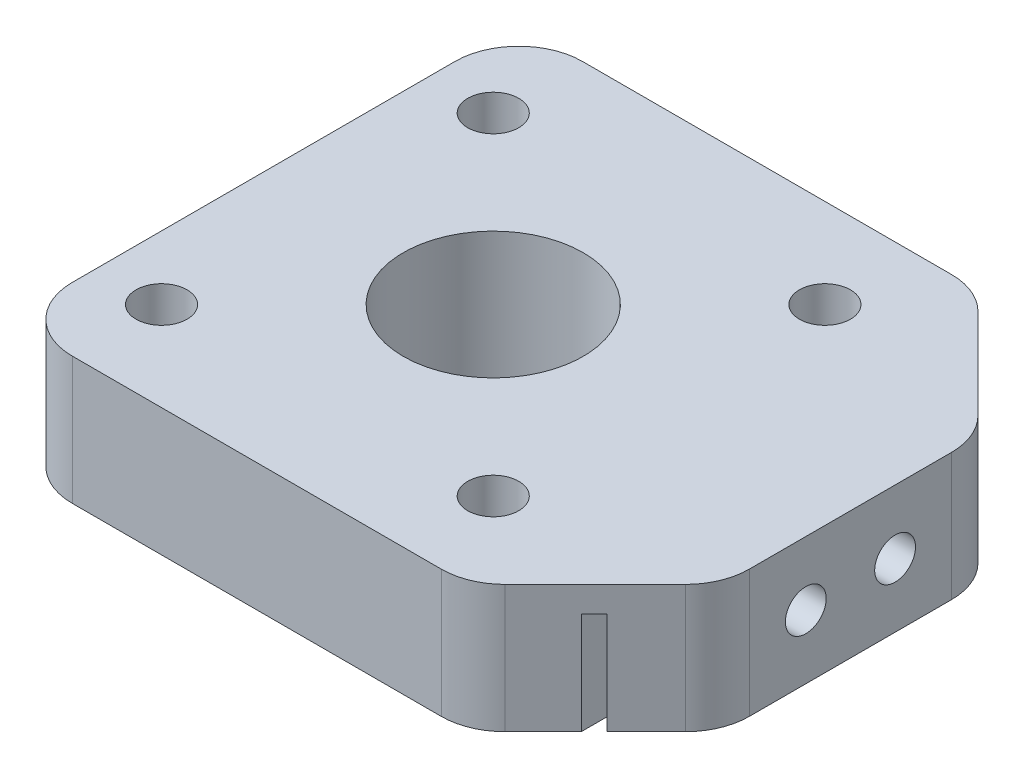
ISO-10303-21;
HEADER;
FILE_DESCRIPTION(('STEP AP214'),'2;1');
FILE_NAME('part.step','',(''),(''),'','','');
FILE_SCHEMA(('AUTOMOTIVE_DESIGN { 1 0 10303 214 1 1 1 1 }'));
ENDSEC;
DATA;
#1=APPLICATION_CONTEXT('core data for automotive mechanical design processes');
#2=APPLICATION_PROTOCOL_DEFINITION('international standard','automotive_design',2000,#1);
#3=PRODUCT_CONTEXT('',#1,'mechanical');
#4=PRODUCT('Part','Part','',(#3));
#5=PRODUCT_RELATED_PRODUCT_CATEGORY('part','',(#4));
#6=PRODUCT_DEFINITION_FORMATION('','',#4);
#7=PRODUCT_DEFINITION_CONTEXT('part definition',#1,'design');
#8=PRODUCT_DEFINITION('design','',#6,#7);
#9=PRODUCT_DEFINITION_SHAPE('','',#8);
#10=(LENGTH_UNIT() NAMED_UNIT(*) SI_UNIT(.MILLI.,.METRE.));
#11=(NAMED_UNIT(*) PLANE_ANGLE_UNIT() SI_UNIT($,.RADIAN.));
#12=(NAMED_UNIT(*) SI_UNIT($,.STERADIAN.) SOLID_ANGLE_UNIT());
#13=UNCERTAINTY_MEASURE_WITH_UNIT(LENGTH_MEASURE(1.E-05),#10,'distance_accuracy_value','');
#14=(GEOMETRIC_REPRESENTATION_CONTEXT(3) GLOBAL_UNCERTAINTY_ASSIGNED_CONTEXT((#13)) GLOBAL_UNIT_ASSIGNED_CONTEXT((#10,
#11,#12)) REPRESENTATION_CONTEXT('',''));
#15=CARTESIAN_POINT('',(0.,0.,0.));
#16=DIRECTION('',(0.,0.,1.));
#17=DIRECTION('',(1.,0.,0.));
#18=AXIS2_PLACEMENT_3D('',#15,#16,#17);
#19=CARTESIAN_POINT('',(0.,0.,0.));
#20=DIRECTION('',(0.,-1.,0.));
#21=DIRECTION('',(0.,0.,-1.));
#22=AXIS2_PLACEMENT_3D('',#19,#20,#21);
#23=PLANE('',#22);
#24=DIRECTION('',(0.,0.,1.));
#25=VECTOR('',#24,1.);
#26=CARTESIAN_POINT('',(22.45,0.,-20.));
#27=LINE('',#26,#25);
#28=CARTESIAN_POINT('',(22.45,0.,-15.55));
#29=VERTEX_POINT('',#28);
#30=CARTESIAN_POINT('',(22.45,0.,15.55));
#31=VERTEX_POINT('',#30);
#32=EDGE_CURVE('E159',#29,#31,#27,.T.);
#33=ORIENTED_EDGE('',*,*,#32,.T.);
#34=DIRECTION('',(0.707106781186543,0.,-0.707106781186551));
#35=VECTOR('',#34,1.);
#36=CARTESIAN_POINT('',(18.,0.,20.));
#37=LINE('',#36,#35);
#38=CARTESIAN_POINT('',(19.4644660940673,0.,18.5355339059327));
#39=VERTEX_POINT('',#38);
#40=EDGE_CURVE('E190',#39,#31,#37,.T.);
#41=ORIENTED_EDGE('',*,*,#40,.F.);
#42=CARTESIAN_POINT('',(15.9289321881345,0.,15.));
#43=DIRECTION('',(0.,-1.,0.));
#44=DIRECTION('',(0.,0.,-1.));
#45=AXIS2_PLACEMENT_3D('',#42,#43,#44);
#46=CIRCLE('',#45,5.);
#47=CARTESIAN_POINT('',(15.9289321881345,0.,20.));
#48=VERTEX_POINT('',#47);
#49=EDGE_CURVE('E251',#39,#48,#46,.T.);
#50=ORIENTED_EDGE('',*,*,#49,.T.);
#51=DIRECTION('',(1.,0.,0.));
#52=VECTOR('',#51,1.);
#53=CARTESIAN_POINT('',(-18.,0.,20.));
#54=LINE('',#53,#52);
#55=CARTESIAN_POINT('',(-13.,0.,20.));
#56=VERTEX_POINT('',#55);
#57=EDGE_CURVE('E231',#56,#48,#54,.T.);
#58=ORIENTED_EDGE('',*,*,#57,.F.);
#59=CARTESIAN_POINT('',(-13.,0.,15.));
#60=DIRECTION('',(0.,-1.,0.));
#61=DIRECTION('',(0.,0.,-1.));
#62=AXIS2_PLACEMENT_3D('',#59,#60,#61);
#63=CIRCLE('',#62,5.);
#64=CARTESIAN_POINT('',(-18.,0.,15.));
#65=VERTEX_POINT('',#64);
#66=EDGE_CURVE('E247',#56,#65,#63,.T.);
#67=ORIENTED_EDGE('',*,*,#66,.T.);
#68=DIRECTION('',(0.,0.,1.));
#69=VECTOR('',#68,1.);
#70=CARTESIAN_POINT('',(-18.,0.,20.));
#71=LINE('',#70,#69);
#72=CARTESIAN_POINT('',(-18.,0.,-15.));
#73=VERTEX_POINT('',#72);
#74=EDGE_CURVE('E239',#73,#65,#71,.T.);
#75=ORIENTED_EDGE('',*,*,#74,.F.);
#76=CARTESIAN_POINT('',(-13.,0.,-15.));
#77=DIRECTION('',(0.,-1.,0.));
#78=DIRECTION('',(0.,0.,-1.));
#79=AXIS2_PLACEMENT_3D('',#76,#77,#78);
#80=CIRCLE('',#79,5.);
#81=CARTESIAN_POINT('',(-13.,0.,-20.));
#82=VERTEX_POINT('',#81);
#83=EDGE_CURVE('E249',#73,#82,#80,.T.);
#84=ORIENTED_EDGE('',*,*,#83,.T.);
#85=DIRECTION('',(-1.,0.,0.));
#86=VECTOR('',#85,1.);
#87=CARTESIAN_POINT('',(-18.,0.,-20.));
#88=LINE('',#87,#86);
#89=CARTESIAN_POINT('',(15.9289321881345,0.,-20.));
#90=VERTEX_POINT('',#89);
#91=EDGE_CURVE('E224',#90,#82,#88,.T.);
#92=ORIENTED_EDGE('',*,*,#91,.F.);
#93=CARTESIAN_POINT('',(15.9289321881345,0.,-15.));
#94=DIRECTION('',(0.,-1.,0.));
#95=DIRECTION('',(0.,0.,-1.));
#96=AXIS2_PLACEMENT_3D('',#93,#94,#95);
#97=CIRCLE('',#96,5.);
#98=CARTESIAN_POINT('',(19.4644660940673,0.,-18.5355339059327));
#99=VERTEX_POINT('',#98);
#100=EDGE_CURVE('E253',#90,#99,#97,.T.);
#101=ORIENTED_EDGE('',*,*,#100,.T.);
#102=DIRECTION('',(-0.707106781186543,0.,-0.707106781186552));
#103=VECTOR('',#102,1.);
#104=CARTESIAN_POINT('',(18.,0.,-20.));
#105=LINE('',#104,#103);
#106=EDGE_CURVE('E174',#29,#99,#105,.T.);
#107=ORIENTED_EDGE('',*,*,#106,.F.);
#108=EDGE_LOOP('',(#33,#41,#50,#58,#67,#75,#84,#92,#101,#107));
#109=FACE_BOUND('',#108,.T.);
#110=CARTESIAN_POINT('',(13.,0.,13.));
#111=DIRECTION('',(0.,1.,0.));
#112=DIRECTION('',(0.,0.,1.));
#113=AXIS2_PLACEMENT_3D('',#110,#111,#112);
#114=CIRCLE('',#113,2.);
#115=CARTESIAN_POINT('',(13.,0.,15.));
#116=VERTEX_POINT('',#115);
#117=EDGE_CURVE('E200',#116,#116,#114,.T.);
#118=ORIENTED_EDGE('',*,*,#117,.T.);
#119=EDGE_LOOP('',(#118));
#120=FACE_BOUND('',#119,.T.);
#121=CARTESIAN_POINT('',(13.,0.,-13.));
#122=DIRECTION('',(0.,1.,0.));
#123=DIRECTION('',(0.,0.,-1.));
#124=AXIS2_PLACEMENT_3D('',#121,#122,#123);
#125=CIRCLE('',#124,2.);
#126=CARTESIAN_POINT('',(13.,0.,-15.));
#127=VERTEX_POINT('',#126);
#128=EDGE_CURVE('E212',#127,#127,#125,.T.);
#129=ORIENTED_EDGE('',*,*,#128,.T.);
#130=EDGE_LOOP('',(#129));
#131=FACE_BOUND('',#130,.T.);
#132=CARTESIAN_POINT('',(-13.,0.,-13.));
#133=DIRECTION('',(0.,1.,0.));
#134=DIRECTION('',(0.,0.,1.));
#135=AXIS2_PLACEMENT_3D('',#132,#133,#134);
#136=CIRCLE('',#135,2.);
#137=CARTESIAN_POINT('',(-13.,0.,-11.));
#138=VERTEX_POINT('',#137);
#139=EDGE_CURVE('E218',#138,#138,#136,.T.);
#140=ORIENTED_EDGE('',*,*,#139,.T.);
#141=EDGE_LOOP('',(#140));
#142=FACE_BOUND('',#141,.T.);
#143=CARTESIAN_POINT('',(-13.,0.,13.));
#144=DIRECTION('',(0.,1.,0.));
#145=DIRECTION('',(0.,0.,-1.));
#146=AXIS2_PLACEMENT_3D('',#143,#144,#145);
#147=CIRCLE('',#146,2.);
#148=CARTESIAN_POINT('',(-13.,0.,11.));
#149=VERTEX_POINT('',#148);
#150=EDGE_CURVE('E206',#149,#149,#147,.T.);
#151=ORIENTED_EDGE('',*,*,#150,.T.);
#152=EDGE_LOOP('',(#151));
#153=FACE_BOUND('',#152,.T.);
#154=CARTESIAN_POINT('',(0.,0.,0.));
#155=DIRECTION('',(0.,1.,0.));
#156=DIRECTION('',(0.,0.,1.));
#157=AXIS2_PLACEMENT_3D('',#154,#155,#156);
#158=CIRCLE('',#157,7.05);
#159=CARTESIAN_POINT('',(0.,0.,7.05));
#160=VERTEX_POINT('',#159);
#161=EDGE_CURVE('E185',#160,#160,#158,.T.);
#162=ORIENTED_EDGE('',*,*,#161,.T.);
#163=EDGE_LOOP('',(#162));
#164=FACE_BOUND('',#163,.T.);
#165=ADVANCED_FACE('F38',(#109,#120,#131,#142,#153,#164),#23,.T.);
#166=CARTESIAN_POINT('',(0.,10.,0.));
#167=DIRECTION('',(0.,-1.,0.));
#168=DIRECTION('',(0.,0.,-1.));
#169=AXIS2_PLACEMENT_3D('',#166,#167,#168);
#170=PLANE('',#169);
#171=DIRECTION('',(-0.707106781186544,0.,0.707106781186552));
#172=VECTOR('',#171,1.);
#173=CARTESIAN_POINT('',(18.,10.,20.));
#174=LINE('',#173,#172);
#175=CARTESIAN_POINT('',(26.5355339059328,10.,11.4644660940672));
#176=VERTEX_POINT('',#175);
#177=CARTESIAN_POINT('',(19.4644660940673,10.,18.5355339059327));
#178=VERTEX_POINT('',#177);
#179=EDGE_CURVE('E178',#176,#178,#174,.T.);
#180=ORIENTED_EDGE('',*,*,#179,.F.);
#181=CARTESIAN_POINT('',(23.,10.,7.92893218813443));
#182=DIRECTION('',(0.,-1.,0.));
#183=DIRECTION('',(0.,0.,-1.));
#184=AXIS2_PLACEMENT_3D('',#181,#182,#183);
#185=CIRCLE('',#184,5.);
#186=CARTESIAN_POINT('',(28.,10.,7.92893218813444));
#187=VERTEX_POINT('',#186);
#188=EDGE_CURVE('E276',#176,#187,#185,.F.);
#189=ORIENTED_EDGE('',*,*,#188,.T.);
#190=DIRECTION('',(0.,0.,1.));
#191=VECTOR('',#190,1.);
#192=CARTESIAN_POINT('',(28.,10.,9.99999999999989));
#193=LINE('',#192,#191);
#194=CARTESIAN_POINT('',(28.,10.,-7.92893218813443));
#195=VERTEX_POINT('',#194);
#196=EDGE_CURVE('E182',#195,#187,#193,.T.);
#197=ORIENTED_EDGE('',*,*,#196,.F.);
#198=CARTESIAN_POINT('',(23.,10.,-7.92893218813443));
#199=DIRECTION('',(0.,-1.,0.));
#200=DIRECTION('',(0.,0.,-1.));
#201=AXIS2_PLACEMENT_3D('',#198,#199,#200);
#202=CIRCLE('',#201,5.);
#203=CARTESIAN_POINT('',(26.5355339059328,10.,-11.4644660940671));
#204=VERTEX_POINT('',#203);
#205=EDGE_CURVE('E274',#195,#204,#202,.F.);
#206=ORIENTED_EDGE('',*,*,#205,.T.);
#207=DIRECTION('',(0.707106781186544,0.,0.707106781186552));
#208=VECTOR('',#207,1.);
#209=CARTESIAN_POINT('',(18.,10.,-20.));
#210=LINE('',#209,#208);
#211=CARTESIAN_POINT('',(19.4644660940673,10.,-18.5355339059327));
#212=VERTEX_POINT('',#211);
#213=EDGE_CURVE('E181',#212,#204,#210,.T.);
#214=ORIENTED_EDGE('',*,*,#213,.F.);
#215=CARTESIAN_POINT('',(15.9289321881345,10.,-15.));
#216=DIRECTION('',(0.,-1.,0.));
#217=DIRECTION('',(0.,0.,-1.));
#218=AXIS2_PLACEMENT_3D('',#215,#216,#217);
#219=CIRCLE('',#218,5.);
#220=CARTESIAN_POINT('',(15.9289321881345,10.,-20.));
#221=VERTEX_POINT('',#220);
#222=EDGE_CURVE('E272',#212,#221,#219,.F.);
#223=ORIENTED_EDGE('',*,*,#222,.T.);
#224=DIRECTION('',(-1.,0.,0.));
#225=VECTOR('',#224,1.);
#226=CARTESIAN_POINT('',(-18.,10.,-20.));
#227=LINE('',#226,#225);
#228=CARTESIAN_POINT('',(-13.,10.,-20.));
#229=VERTEX_POINT('',#228);
#230=EDGE_CURVE('E227',#221,#229,#227,.T.);
#231=ORIENTED_EDGE('',*,*,#230,.T.);
#232=CARTESIAN_POINT('',(-13.,10.,-15.));
#233=DIRECTION('',(0.,-1.,0.));
#234=DIRECTION('',(0.,0.,-1.));
#235=AXIS2_PLACEMENT_3D('',#232,#233,#234);
#236=CIRCLE('',#235,5.);
#237=CARTESIAN_POINT('',(-18.,10.,-15.));
#238=VERTEX_POINT('',#237);
#239=EDGE_CURVE('E268',#229,#238,#236,.F.);
#240=ORIENTED_EDGE('',*,*,#239,.T.);
#241=DIRECTION('',(0.,0.,1.));
#242=VECTOR('',#241,1.);
#243=CARTESIAN_POINT('',(-18.,10.,20.));
#244=LINE('',#243,#242);
#245=CARTESIAN_POINT('',(-18.,10.,15.));
#246=VERTEX_POINT('',#245);
#247=EDGE_CURVE('E230',#238,#246,#244,.T.);
#248=ORIENTED_EDGE('',*,*,#247,.T.);
#249=CARTESIAN_POINT('',(-13.,10.,15.));
#250=DIRECTION('',(0.,-1.,0.));
#251=DIRECTION('',(0.,0.,-1.));
#252=AXIS2_PLACEMENT_3D('',#249,#250,#251);
#253=CIRCLE('',#252,5.);
#254=CARTESIAN_POINT('',(-13.,10.,20.));
#255=VERTEX_POINT('',#254);
#256=EDGE_CURVE('E266',#246,#255,#253,.F.);
#257=ORIENTED_EDGE('',*,*,#256,.T.);
#258=DIRECTION('',(1.,0.,0.));
#259=VECTOR('',#258,1.);
#260=CARTESIAN_POINT('',(-18.,10.,20.));
#261=LINE('',#260,#259);
#262=CARTESIAN_POINT('',(15.9289321881345,10.,20.));
#263=VERTEX_POINT('',#262);
#264=EDGE_CURVE('E233',#255,#263,#261,.T.);
#265=ORIENTED_EDGE('',*,*,#264,.T.);
#266=CARTESIAN_POINT('',(15.9289321881345,10.,15.));
#267=DIRECTION('',(0.,-1.,0.));
#268=DIRECTION('',(0.,0.,-1.));
#269=AXIS2_PLACEMENT_3D('',#266,#267,#268);
#270=CIRCLE('',#269,5.);
#271=EDGE_CURVE('E270',#263,#178,#270,.F.);
#272=ORIENTED_EDGE('',*,*,#271,.T.);
#273=EDGE_LOOP('',(#180,#189,#197,#206,#214,#223,#231,#240,#248,#257,#265,#272));
#274=FACE_BOUND('',#273,.T.);
#275=CARTESIAN_POINT('',(-13.,10.,-13.));
#276=DIRECTION('',(0.,1.,0.));
#277=DIRECTION('',(0.,0.,1.));
#278=AXIS2_PLACEMENT_3D('',#275,#276,#277);
#279=CIRCLE('',#278,2.);
#280=CARTESIAN_POINT('',(-13.,10.,-11.));
#281=VERTEX_POINT('',#280);
#282=EDGE_CURVE('E221',#281,#281,#279,.T.);
#283=ORIENTED_EDGE('',*,*,#282,.F.);
#284=EDGE_LOOP('',(#283));
#285=FACE_BOUND('',#284,.T.);
#286=CARTESIAN_POINT('',(13.,10.,-13.));
#287=DIRECTION('',(0.,1.,0.));
#288=DIRECTION('',(0.,0.,-1.));
#289=AXIS2_PLACEMENT_3D('',#286,#287,#288);
#290=CIRCLE('',#289,2.);
#291=CARTESIAN_POINT('',(13.,10.,-15.));
#292=VERTEX_POINT('',#291);
#293=EDGE_CURVE('E215',#292,#292,#290,.T.);
#294=ORIENTED_EDGE('',*,*,#293,.F.);
#295=EDGE_LOOP('',(#294));
#296=FACE_BOUND('',#295,.T.);
#297=CARTESIAN_POINT('',(-13.,10.,13.));
#298=DIRECTION('',(0.,1.,0.));
#299=DIRECTION('',(0.,0.,-1.));
#300=AXIS2_PLACEMENT_3D('',#297,#298,#299);
#301=CIRCLE('',#300,2.);
#302=CARTESIAN_POINT('',(-13.,10.,11.));
#303=VERTEX_POINT('',#302);
#304=EDGE_CURVE('E209',#303,#303,#301,.T.);
#305=ORIENTED_EDGE('',*,*,#304,.F.);
#306=EDGE_LOOP('',(#305));
#307=FACE_BOUND('',#306,.T.);
#308=CARTESIAN_POINT('',(13.,10.,13.));
#309=DIRECTION('',(0.,1.,0.));
#310=DIRECTION('',(0.,0.,1.));
#311=AXIS2_PLACEMENT_3D('',#308,#309,#310);
#312=CIRCLE('',#311,2.);
#313=CARTESIAN_POINT('',(13.,10.,15.));
#314=VERTEX_POINT('',#313);
#315=EDGE_CURVE('E203',#314,#314,#312,.T.);
#316=ORIENTED_EDGE('',*,*,#315,.F.);
#317=EDGE_LOOP('',(#316));
#318=FACE_BOUND('',#317,.T.);
#319=CARTESIAN_POINT('',(0.,10.,0.));
#320=DIRECTION('',(0.,1.,0.));
#321=DIRECTION('',(0.,0.,1.));
#322=AXIS2_PLACEMENT_3D('',#319,#320,#321);
#323=CIRCLE('',#322,7.05);
#324=CARTESIAN_POINT('',(0.,10.,7.05));
#325=VERTEX_POINT('',#324);
#326=EDGE_CURVE('E197',#325,#325,#323,.T.);
#327=ORIENTED_EDGE('',*,*,#326,.F.);
#328=EDGE_LOOP('',(#327));
#329=FACE_BOUND('',#328,.T.);
#330=ADVANCED_FACE('F339',(#274,#285,#296,#307,#318,#329),#170,.F.);
#331=DIRECTION('',(0.,0.,1.));
#332=VECTOR('',#331,1.);
#333=CARTESIAN_POINT('',(23.45,0.,-20.));
#334=LINE('',#333,#332);
#335=CARTESIAN_POINT('',(23.45,0.,-14.5499999999999));
#336=VERTEX_POINT('',#335);
#337=CARTESIAN_POINT('',(23.45,0.,14.5499999999999));
#338=VERTEX_POINT('',#337);
#339=EDGE_CURVE('E154',#336,#338,#334,.T.);
#340=ORIENTED_EDGE('',*,*,#339,.F.);
#341=CARTESIAN_POINT('',(26.5355339059328,0.,-11.4644660940671));
#342=VERTEX_POINT('',#341);
#343=EDGE_CURVE('E186',#342,#336,#105,.T.);
#344=ORIENTED_EDGE('',*,*,#343,.F.);
#345=CARTESIAN_POINT('',(23.,0.,-7.92893218813443));
#346=DIRECTION('',(0.,-1.,0.));
#347=DIRECTION('',(0.,0.,-1.));
#348=AXIS2_PLACEMENT_3D('',#345,#346,#347);
#349=CIRCLE('',#348,5.);
#350=CARTESIAN_POINT('',(28.,0.,-7.92893218813443));
#351=VERTEX_POINT('',#350);
#352=EDGE_CURVE('E256',#342,#351,#349,.T.);
#353=ORIENTED_EDGE('',*,*,#352,.T.);
#354=DIRECTION('',(0.,0.,-1.));
#355=VECTOR('',#354,1.);
#356=CARTESIAN_POINT('',(28.,0.,9.99999999999989));
#357=LINE('',#356,#355);
#358=CARTESIAN_POINT('',(28.,0.,7.92893218813444));
#359=VERTEX_POINT('',#358);
#360=EDGE_CURVE('E192',#359,#351,#357,.T.);
#361=ORIENTED_EDGE('',*,*,#360,.F.);
#362=CARTESIAN_POINT('',(23.,0.,7.92893218813443));
#363=DIRECTION('',(0.,-1.,0.));
#364=DIRECTION('',(0.,0.,-1.));
#365=AXIS2_PLACEMENT_3D('',#362,#363,#364);
#366=CIRCLE('',#365,5.);
#367=CARTESIAN_POINT('',(26.5355339059327,0.,11.4644660940672));
#368=VERTEX_POINT('',#367);
#369=EDGE_CURVE('E258',#359,#368,#366,.T.);
#370=ORIENTED_EDGE('',*,*,#369,.T.);
#371=EDGE_CURVE('E189',#338,#368,#37,.T.);
#372=ORIENTED_EDGE('',*,*,#371,.F.);
#373=EDGE_LOOP('',(#340,#344,#353,#361,#370,#372));
#374=FACE_BOUND('',#373,.T.);
#375=ADVANCED_FACE('F303',(#374),#23,.T.);
#376=CARTESIAN_POINT('',(-18.,10.,-20.));
#377=DIRECTION('',(0.,0.,1.));
#378=DIRECTION('',(1.,0.,0.));
#379=AXIS2_PLACEMENT_3D('',#376,#377,#378);
#380=PLANE('',#379);
#381=ORIENTED_EDGE('',*,*,#230,.F.);
#382=DIRECTION('',(0.,-1.,0.));
#383=VECTOR('',#382,1.);
#384=CARTESIAN_POINT('',(15.9289321881345,10.,-20.));
#385=LINE('',#384,#383);
#386=EDGE_CURVE('E285',#221,#90,#385,.T.);
#387=ORIENTED_EDGE('',*,*,#386,.T.);
#388=ORIENTED_EDGE('',*,*,#91,.T.);
#389=DIRECTION('',(0.,-1.,0.));
#390=VECTOR('',#389,1.);
#391=CARTESIAN_POINT('',(-13.,10.,-20.));
#392=LINE('',#391,#390);
#393=EDGE_CURVE('E283',#82,#229,#392,.F.);
#394=ORIENTED_EDGE('',*,*,#393,.T.);
#395=EDGE_LOOP('',(#381,#387,#388,#394));
#396=FACE_BOUND('',#395,.T.);
#397=ADVANCED_FACE('F350',(#396),#380,.F.);
#398=CARTESIAN_POINT('',(-18.,10.,20.));
#399=DIRECTION('',(1.,0.,0.));
#400=DIRECTION('',(0.,0.,-1.));
#401=AXIS2_PLACEMENT_3D('',#398,#399,#400);
#402=PLANE('',#401);
#403=ORIENTED_EDGE('',*,*,#247,.F.);
#404=DIRECTION('',(0.,-1.,0.));
#405=VECTOR('',#404,1.);
#406=CARTESIAN_POINT('',(-18.,10.,-15.));
#407=LINE('',#406,#405);
#408=EDGE_CURVE('E294',#238,#73,#407,.T.);
#409=ORIENTED_EDGE('',*,*,#408,.T.);
#410=ORIENTED_EDGE('',*,*,#74,.T.);
#411=DIRECTION('',(0.,-1.,0.));
#412=VECTOR('',#411,1.);
#413=CARTESIAN_POINT('',(-18.,10.,15.));
#414=LINE('',#413,#412);
#415=EDGE_CURVE('E61',#65,#246,#414,.F.);
#416=ORIENTED_EDGE('',*,*,#415,.T.);
#417=EDGE_LOOP('',(#403,#409,#410,#416));
#418=FACE_BOUND('',#417,.T.);
#419=ADVANCED_FACE('F354',(#418),#402,.F.);
#420=CARTESIAN_POINT('',(-18.,10.,20.));
#421=DIRECTION('',(0.,0.,-1.));
#422=DIRECTION('',(-1.,0.,0.));
#423=AXIS2_PLACEMENT_3D('',#420,#421,#422);
#424=PLANE('',#423);
#425=ORIENTED_EDGE('',*,*,#57,.T.);
#426=DIRECTION('',(0.,-1.,0.));
#427=VECTOR('',#426,1.);
#428=CARTESIAN_POINT('',(15.9289321881345,10.,20.));
#429=LINE('',#428,#427);
#430=EDGE_CURVE('E291',#48,#263,#429,.F.);
#431=ORIENTED_EDGE('',*,*,#430,.T.);
#432=ORIENTED_EDGE('',*,*,#264,.F.);
#433=DIRECTION('',(0.,-1.,0.));
#434=VECTOR('',#433,1.);
#435=CARTESIAN_POINT('',(-13.,10.,20.));
#436=LINE('',#435,#434);
#437=EDGE_CURVE('E288',#255,#56,#436,.T.);
#438=ORIENTED_EDGE('',*,*,#437,.T.);
#439=EDGE_LOOP('',(#425,#431,#432,#438));
#440=FACE_BOUND('',#439,.T.);
#441=ADVANCED_FACE('F360',(#440),#424,.F.);
#442=CARTESIAN_POINT('',(-13.,10.,-13.));
#443=DIRECTION('',(0.,-1.,0.));
#444=DIRECTION('',(0.,0.,-1.));
#445=AXIS2_PLACEMENT_3D('',#442,#443,#444);
#446=CYLINDRICAL_SURFACE('',#445,2.);
#447=ORIENTED_EDGE('',*,*,#282,.T.);
#448=EDGE_LOOP('',(#447));
#449=FACE_BOUND('',#448,.T.);
#450=ORIENTED_EDGE('',*,*,#139,.F.);
#451=EDGE_LOOP('',(#450));
#452=FACE_BOUND('',#451,.T.);
#453=ADVANCED_FACE('F433',(#449,#452),#446,.F.);
#454=CARTESIAN_POINT('',(13.,10.,-13.));
#455=DIRECTION('',(0.,-1.,0.));
#456=DIRECTION('',(0.,0.,-1.));
#457=AXIS2_PLACEMENT_3D('',#454,#455,#456);
#458=CYLINDRICAL_SURFACE('',#457,2.);
#459=ORIENTED_EDGE('',*,*,#293,.T.);
#460=EDGE_LOOP('',(#459));
#461=FACE_BOUND('',#460,.T.);
#462=ORIENTED_EDGE('',*,*,#128,.F.);
#463=EDGE_LOOP('',(#462));
#464=FACE_BOUND('',#463,.T.);
#465=ADVANCED_FACE('F429',(#461,#464),#458,.F.);
#466=CARTESIAN_POINT('',(-13.,10.,13.));
#467=DIRECTION('',(0.,-1.,0.));
#468=DIRECTION('',(0.,0.,-1.));
#469=AXIS2_PLACEMENT_3D('',#466,#467,#468);
#470=CYLINDRICAL_SURFACE('',#469,2.);
#471=ORIENTED_EDGE('',*,*,#304,.T.);
#472=EDGE_LOOP('',(#471));
#473=FACE_BOUND('',#472,.T.);
#474=ORIENTED_EDGE('',*,*,#150,.F.);
#475=EDGE_LOOP('',(#474));
#476=FACE_BOUND('',#475,.T.);
#477=ADVANCED_FACE('F425',(#473,#476),#470,.F.);
#478=CARTESIAN_POINT('',(13.,10.,13.));
#479=DIRECTION('',(0.,-1.,0.));
#480=DIRECTION('',(0.,0.,-1.));
#481=AXIS2_PLACEMENT_3D('',#478,#479,#480);
#482=CYLINDRICAL_SURFACE('',#481,2.);
#483=ORIENTED_EDGE('',*,*,#315,.T.);
#484=EDGE_LOOP('',(#483));
#485=FACE_BOUND('',#484,.T.);
#486=ORIENTED_EDGE('',*,*,#117,.F.);
#487=EDGE_LOOP('',(#486));
#488=FACE_BOUND('',#487,.T.);
#489=ADVANCED_FACE('F421',(#485,#488),#482,.F.);
#490=CARTESIAN_POINT('',(0.,10.,0.));
#491=DIRECTION('',(0.,-1.,0.));
#492=DIRECTION('',(0.,0.,-1.));
#493=AXIS2_PLACEMENT_3D('',#490,#491,#492);
#494=CYLINDRICAL_SURFACE('',#493,7.05);
#495=ORIENTED_EDGE('',*,*,#326,.T.);
#496=EDGE_LOOP('',(#495));
#497=FACE_BOUND('',#496,.T.);
#498=ORIENTED_EDGE('',*,*,#161,.F.);
#499=EDGE_LOOP('',(#498));
#500=FACE_BOUND('',#499,.T.);
#501=ADVANCED_FACE('F413',(#497,#500),#494,.F.);
#502=CARTESIAN_POINT('',(28.,51.2310562561766,9.99999999999989));
#503=DIRECTION('',(-1.,0.,0.));
#504=DIRECTION('',(0.,0.,1.));
#505=AXIS2_PLACEMENT_3D('',#502,#503,#504);
#506=PLANE('',#505);
#507=CARTESIAN_POINT('',(28.,5.,3.50000000000001));
#508=DIRECTION('',(1.,0.,0.));
#509=DIRECTION('',(0.,0.,-1.));
#510=AXIS2_PLACEMENT_3D('',#507,#508,#509);
#511=CIRCLE('',#510,1.6);
#512=CARTESIAN_POINT('',(28.,5.,1.90000000000001));
#513=VERTEX_POINT('',#512);
#514=EDGE_CURVE('E304',#513,#513,#511,.T.);
#515=ORIENTED_EDGE('',*,*,#514,.F.);
#516=EDGE_LOOP('',(#515));
#517=FACE_BOUND('',#516,.T.);
#518=CARTESIAN_POINT('',(28.,5.,-3.49999999999999));
#519=DIRECTION('',(1.,0.,0.));
#520=DIRECTION('',(0.,0.,1.));
#521=AXIS2_PLACEMENT_3D('',#518,#519,#520);
#522=CIRCLE('',#521,1.6);
#523=CARTESIAN_POINT('',(28.,5.,-1.89999999999999));
#524=VERTEX_POINT('',#523);
#525=EDGE_CURVE('E312',#524,#524,#522,.T.);
#526=ORIENTED_EDGE('',*,*,#525,.F.);
#527=EDGE_LOOP('',(#526));
#528=FACE_BOUND('',#527,.T.);
#529=ORIENTED_EDGE('',*,*,#196,.T.);
#530=DIRECTION('',(0.,-1.,0.));
#531=VECTOR('',#530,1.);
#532=CARTESIAN_POINT('',(28.,51.2310562561766,7.92893218813444));
#533=LINE('',#532,#531);
#534=EDGE_CURVE('E244',#187,#359,#533,.T.);
#535=ORIENTED_EDGE('',*,*,#534,.T.);
#536=ORIENTED_EDGE('',*,*,#360,.T.);
#537=DIRECTION('',(0.,-1.,0.));
#538=VECTOR('',#537,1.);
#539=CARTESIAN_POINT('',(28.,51.2310562561766,-7.92893218813443));
#540=LINE('',#539,#538);
#541=EDGE_CURVE('E236',#351,#195,#540,.F.);
#542=ORIENTED_EDGE('',*,*,#541,.T.);
#543=EDGE_LOOP('',(#529,#535,#536,#542));
#544=FACE_BOUND('',#543,.T.);
#545=ADVANCED_FACE('F410',(#517,#528,#544),#506,.F.);
#546=CARTESIAN_POINT('',(18.,51.2310562561766,20.));
#547=DIRECTION('',(-0.707106781186551,0.,-0.707106781186543));
#548=DIRECTION('',(-0.707106781186544,0.,0.707106781186552));
#549=AXIS2_PLACEMENT_3D('',#546,#547,#548);
#550=PLANE('',#549);
#551=ORIENTED_EDGE('',*,*,#40,.T.);
#552=DIRECTION('',(0.,1.,0.));
#553=VECTOR('',#552,1.);
#554=CARTESIAN_POINT('',(22.45,51.2310562561766,15.55));
#555=LINE('',#554,#553);
#556=CARTESIAN_POINT('',(22.45,8.,15.5499999999999));
#557=VERTEX_POINT('',#556);
#558=EDGE_CURVE('E172',#31,#557,#555,.T.);
#559=ORIENTED_EDGE('',*,*,#558,.T.);
#560=DIRECTION('',(0.707106781186544,0.,-0.707106781186552));
#561=VECTOR('',#560,1.);
#562=CARTESIAN_POINT('',(18.,8.,20.));
#563=LINE('',#562,#561);
#564=CARTESIAN_POINT('',(23.45,8.,14.5499999999999));
#565=VERTEX_POINT('',#564);
#566=EDGE_CURVE('E158',#557,#565,#563,.T.);
#567=ORIENTED_EDGE('',*,*,#566,.T.);
#568=DIRECTION('',(0.,-1.,0.));
#569=VECTOR('',#568,1.);
#570=CARTESIAN_POINT('',(23.45,51.2310562561766,14.5499999999999));
#571=LINE('',#570,#569);
#572=EDGE_CURVE('E151',#565,#338,#571,.T.);
#573=ORIENTED_EDGE('',*,*,#572,.T.);
#574=ORIENTED_EDGE('',*,*,#371,.T.);
#575=DIRECTION('',(0.,-1.,0.));
#576=VECTOR('',#575,1.);
#577=CARTESIAN_POINT('',(26.5355339059328,51.2310562561766,11.4644660940672));
#578=LINE('',#577,#576);
#579=EDGE_CURVE('E264',#368,#176,#578,.F.);
#580=ORIENTED_EDGE('',*,*,#579,.T.);
#581=ORIENTED_EDGE('',*,*,#179,.T.);
#582=DIRECTION('',(0.,-1.,0.));
#583=VECTOR('',#582,1.);
#584=CARTESIAN_POINT('',(19.4644660940673,51.2310562561766,18.5355339059327));
#585=LINE('',#584,#583);
#586=EDGE_CURVE('E261',#178,#39,#585,.T.);
#587=ORIENTED_EDGE('',*,*,#586,.T.);
#588=EDGE_LOOP('',(#551,#559,#567,#573,#574,#580,#581,#587));
#589=FACE_BOUND('',#588,.T.);
#590=ADVANCED_FACE('F171',(#589),#550,.F.);
#591=CARTESIAN_POINT('',(18.,51.2310562561766,-20.));
#592=DIRECTION('',(-0.707106781186551,0.,0.707106781186543));
#593=DIRECTION('',(0.707106781186544,0.,0.707106781186552));
#594=AXIS2_PLACEMENT_3D('',#591,#592,#593);
#595=PLANE('',#594);
#596=DIRECTION('',(-0.707106781186544,0.,-0.707106781186552));
#597=VECTOR('',#596,1.);
#598=CARTESIAN_POINT('',(18.,8.,-20.));
#599=LINE('',#598,#597);
#600=CARTESIAN_POINT('',(23.45,8.,-14.5499999999999));
#601=VERTEX_POINT('',#600);
#602=CARTESIAN_POINT('',(22.45,8.,-15.5499999999999));
#603=VERTEX_POINT('',#602);
#604=EDGE_CURVE('E46',#601,#603,#599,.T.);
#605=ORIENTED_EDGE('',*,*,#604,.T.);
#606=DIRECTION('',(0.,-1.,0.));
#607=VECTOR('',#606,1.);
#608=CARTESIAN_POINT('',(22.45,51.2310562561766,-15.55));
#609=LINE('',#608,#607);
#610=EDGE_CURVE('E11',#603,#29,#609,.T.);
#611=ORIENTED_EDGE('',*,*,#610,.T.);
#612=ORIENTED_EDGE('',*,*,#106,.T.);
#613=DIRECTION('',(0.,-1.,0.));
#614=VECTOR('',#613,1.);
#615=CARTESIAN_POINT('',(19.4644660940673,51.2310562561766,-18.5355339059327));
#616=LINE('',#615,#614);
#617=EDGE_CURVE('E278',#99,#212,#616,.F.);
#618=ORIENTED_EDGE('',*,*,#617,.T.);
#619=ORIENTED_EDGE('',*,*,#213,.T.);
#620=DIRECTION('',(0.,-1.,0.));
#621=VECTOR('',#620,1.);
#622=CARTESIAN_POINT('',(26.5355339059328,51.2310562561766,-11.4644660940671));
#623=LINE('',#622,#621);
#624=EDGE_CURVE('E280',#204,#342,#623,.T.);
#625=ORIENTED_EDGE('',*,*,#624,.T.);
#626=ORIENTED_EDGE('',*,*,#343,.T.);
#627=DIRECTION('',(0.,1.,0.));
#628=VECTOR('',#627,1.);
#629=CARTESIAN_POINT('',(23.45,51.2310562561766,-14.5499999999999));
#630=LINE('',#629,#628);
#631=EDGE_CURVE('E297',#336,#601,#630,.T.);
#632=ORIENTED_EDGE('',*,*,#631,.T.);
#633=EDGE_LOOP('',(#605,#611,#612,#618,#619,#625,#626,#632));
#634=FACE_BOUND('',#633,.T.);
#635=ADVANCED_FACE('F299',(#634),#595,.F.);
#636=CARTESIAN_POINT('',(23.,51.2310562561766,7.92893218813443));
#637=DIRECTION('',(0.,-1.,0.));
#638=DIRECTION('',(0.,0.,-1.));
#639=AXIS2_PLACEMENT_3D('',#636,#637,#638);
#640=CYLINDRICAL_SURFACE('',#639,5.);
#641=ORIENTED_EDGE('',*,*,#188,.F.);
#642=ORIENTED_EDGE('',*,*,#579,.F.);
#643=ORIENTED_EDGE('',*,*,#369,.F.);
#644=ORIENTED_EDGE('',*,*,#534,.F.);
#645=EDGE_LOOP('',(#641,#642,#643,#644));
#646=FACE_BOUND('',#645,.T.);
#647=ADVANCED_FACE('F364',(#646),#640,.T.);
#648=CARTESIAN_POINT('',(23.,51.2310562561766,-7.92893218813443));
#649=DIRECTION('',(0.,-1.,0.));
#650=DIRECTION('',(0.,0.,-1.));
#651=AXIS2_PLACEMENT_3D('',#648,#649,#650);
#652=CYLINDRICAL_SURFACE('',#651,5.);
#653=ORIENTED_EDGE('',*,*,#205,.F.);
#654=ORIENTED_EDGE('',*,*,#541,.F.);
#655=ORIENTED_EDGE('',*,*,#352,.F.);
#656=ORIENTED_EDGE('',*,*,#624,.F.);
#657=EDGE_LOOP('',(#653,#654,#655,#656));
#658=FACE_BOUND('',#657,.T.);
#659=ADVANCED_FACE('F367',(#658),#652,.T.);
#660=CARTESIAN_POINT('',(15.9289321881345,10.,-15.));
#661=DIRECTION('',(0.,-1.,0.));
#662=DIRECTION('',(0.,0.,-1.));
#663=AXIS2_PLACEMENT_3D('',#660,#661,#662);
#664=CYLINDRICAL_SURFACE('',#663,5.);
#665=ORIENTED_EDGE('',*,*,#222,.F.);
#666=ORIENTED_EDGE('',*,*,#617,.F.);
#667=ORIENTED_EDGE('',*,*,#100,.F.);
#668=ORIENTED_EDGE('',*,*,#386,.F.);
#669=EDGE_LOOP('',(#665,#666,#667,#668));
#670=FACE_BOUND('',#669,.T.);
#671=ADVANCED_FACE('F371',(#670),#664,.T.);
#672=CARTESIAN_POINT('',(15.9289321881345,51.2310562561766,15.));
#673=DIRECTION('',(0.,-1.,0.));
#674=DIRECTION('',(0.,0.,-1.));
#675=AXIS2_PLACEMENT_3D('',#672,#673,#674);
#676=CYLINDRICAL_SURFACE('',#675,5.);
#677=ORIENTED_EDGE('',*,*,#271,.F.);
#678=ORIENTED_EDGE('',*,*,#430,.F.);
#679=ORIENTED_EDGE('',*,*,#49,.F.);
#680=ORIENTED_EDGE('',*,*,#586,.F.);
#681=EDGE_LOOP('',(#677,#678,#679,#680));
#682=FACE_BOUND('',#681,.T.);
#683=ADVANCED_FACE('F375',(#682),#676,.T.);
#684=CARTESIAN_POINT('',(-13.,10.,-15.));
#685=DIRECTION('',(0.,-1.,0.));
#686=DIRECTION('',(0.,0.,-1.));
#687=AXIS2_PLACEMENT_3D('',#684,#685,#686);
#688=CYLINDRICAL_SURFACE('',#687,5.);
#689=ORIENTED_EDGE('',*,*,#239,.F.);
#690=ORIENTED_EDGE('',*,*,#393,.F.);
#691=ORIENTED_EDGE('',*,*,#83,.F.);
#692=ORIENTED_EDGE('',*,*,#408,.F.);
#693=EDGE_LOOP('',(#689,#690,#691,#692));
#694=FACE_BOUND('',#693,.T.);
#695=ADVANCED_FACE('F378',(#694),#688,.T.);
#696=CARTESIAN_POINT('',(-13.,10.,15.));
#697=DIRECTION('',(0.,-1.,0.));
#698=DIRECTION('',(0.,0.,-1.));
#699=AXIS2_PLACEMENT_3D('',#696,#697,#698);
#700=CYLINDRICAL_SURFACE('',#699,5.);
#701=ORIENTED_EDGE('',*,*,#256,.F.);
#702=ORIENTED_EDGE('',*,*,#415,.F.);
#703=ORIENTED_EDGE('',*,*,#66,.F.);
#704=ORIENTED_EDGE('',*,*,#437,.F.);
#705=EDGE_LOOP('',(#701,#702,#703,#704));
#706=FACE_BOUND('',#705,.T.);
#707=ADVANCED_FACE('F40',(#706),#700,.T.);
#708=CARTESIAN_POINT('',(22.45,0.,-20.));
#709=DIRECTION('',(-1.,0.,0.));
#710=DIRECTION('',(0.,0.,1.));
#711=AXIS2_PLACEMENT_3D('',#708,#709,#710);
#712=PLANE('',#711);
#713=ORIENTED_EDGE('',*,*,#32,.F.);
#714=ORIENTED_EDGE('',*,*,#610,.F.);
#715=DIRECTION('',(0.,0.,1.));
#716=VECTOR('',#715,1.);
#717=CARTESIAN_POINT('',(22.45,8.,-20.));
#718=LINE('',#717,#716);
#719=EDGE_CURVE('E167',#603,#557,#718,.T.);
#720=ORIENTED_EDGE('',*,*,#719,.T.);
#721=ORIENTED_EDGE('',*,*,#558,.F.);
#722=EDGE_LOOP('',(#713,#714,#720,#721));
#723=FACE_BOUND('',#722,.T.);
#724=ADVANCED_FACE('F385',(#723),#712,.F.);
#725=CARTESIAN_POINT('',(22.45,8.,-20.));
#726=DIRECTION('',(0.,1.,0.));
#727=DIRECTION('',(0.,0.,1.));
#728=AXIS2_PLACEMENT_3D('',#725,#726,#727);
#729=PLANE('',#728);
#730=ORIENTED_EDGE('',*,*,#719,.F.);
#731=ORIENTED_EDGE('',*,*,#604,.F.);
#732=DIRECTION('',(0.,0.,1.));
#733=VECTOR('',#732,1.);
#734=CARTESIAN_POINT('',(23.45,8.,-20.));
#735=LINE('',#734,#733);
#736=EDGE_CURVE('E53',#601,#565,#735,.T.);
#737=ORIENTED_EDGE('',*,*,#736,.T.);
#738=ORIENTED_EDGE('',*,*,#566,.F.);
#739=EDGE_LOOP('',(#730,#731,#737,#738));
#740=FACE_BOUND('',#739,.T.);
#741=ADVANCED_FACE('F163',(#740),#729,.F.);
#742=CARTESIAN_POINT('',(23.45,8.,-20.));
#743=DIRECTION('',(1.,0.,0.));
#744=DIRECTION('',(0.,0.,-1.));
#745=AXIS2_PLACEMENT_3D('',#742,#743,#744);
#746=PLANE('',#745);
#747=CARTESIAN_POINT('',(23.45,5.,3.50000000000001));
#748=DIRECTION('',(1.,0.,0.));
#749=DIRECTION('',(0.,0.,-1.));
#750=AXIS2_PLACEMENT_3D('',#747,#748,#749);
#751=CIRCLE('',#750,1.6);
#752=CARTESIAN_POINT('',(23.45,5.,1.90000000000001));
#753=VERTEX_POINT('',#752);
#754=EDGE_CURVE('E306',#753,#753,#751,.F.);
#755=ORIENTED_EDGE('',*,*,#754,.F.);
#756=EDGE_LOOP('',(#755));
#757=FACE_BOUND('',#756,.T.);
#758=CARTESIAN_POINT('',(23.45,5.,-3.49999999999999));
#759=DIRECTION('',(1.,0.,0.));
#760=DIRECTION('',(0.,0.,-1.));
#761=AXIS2_PLACEMENT_3D('',#758,#759,#760);
#762=CIRCLE('',#761,1.6);
#763=CARTESIAN_POINT('',(23.45,5.,-5.09999999999999));
#764=VERTEX_POINT('',#763);
#765=EDGE_CURVE('E315',#764,#764,#762,.F.);
#766=ORIENTED_EDGE('',*,*,#765,.F.);
#767=EDGE_LOOP('',(#766));
#768=FACE_BOUND('',#767,.T.);
#769=ORIENTED_EDGE('',*,*,#736,.F.);
#770=ORIENTED_EDGE('',*,*,#631,.F.);
#771=ORIENTED_EDGE('',*,*,#339,.T.);
#772=ORIENTED_EDGE('',*,*,#572,.F.);
#773=EDGE_LOOP('',(#769,#770,#771,#772));
#774=FACE_BOUND('',#773,.T.);
#775=ADVANCED_FACE('F152',(#757,#768,#774),#746,.F.);
#776=CARTESIAN_POINT('',(-18.001,5.,-3.50000000000001));
#777=DIRECTION('',(1.,0.,0.));
#778=DIRECTION('',(0.,0.,-1.));
#779=AXIS2_PLACEMENT_3D('',#776,#777,#778);
#780=CYLINDRICAL_SURFACE('',#779,1.6);
#781=ORIENTED_EDGE('',*,*,#525,.T.);
#782=EDGE_LOOP('',(#781));
#783=FACE_BOUND('',#782,.T.);
#784=ORIENTED_EDGE('',*,*,#765,.T.);
#785=EDGE_LOOP('',(#784));
#786=FACE_BOUND('',#785,.T.);
#787=ADVANCED_FACE('F325',(#783,#786),#780,.F.);
#788=CARTESIAN_POINT('',(-18.001,5.,3.49999999999999));
#789=DIRECTION('',(1.,0.,0.));
#790=DIRECTION('',(0.,0.,-1.));
#791=AXIS2_PLACEMENT_3D('',#788,#789,#790);
#792=CYLINDRICAL_SURFACE('',#791,1.6);
#793=ORIENTED_EDGE('',*,*,#514,.T.);
#794=EDGE_LOOP('',(#793));
#795=FACE_BOUND('',#794,.T.);
#796=ORIENTED_EDGE('',*,*,#754,.T.);
#797=EDGE_LOOP('',(#796));
#798=FACE_BOUND('',#797,.T.);
#799=ADVANCED_FACE('F321',(#795,#798),#792,.F.);
#800=CLOSED_SHELL('',(#165,#330,#375,#397,#419,#441,#453,#465,#477,#489,#501,#545,#590,#635,
#647,#659,#671,#683,#695,#707,#724,#741,#775,#787,#799));
#801=MANIFOLD_SOLID_BREP('B2',#800);
#802=ADVANCED_BREP_SHAPE_REPRESENTATION('',(#18,#801),#14);
#803=SHAPE_DEFINITION_REPRESENTATION(#9,#802);
ENDSEC;
END-ISO-10303-21;
